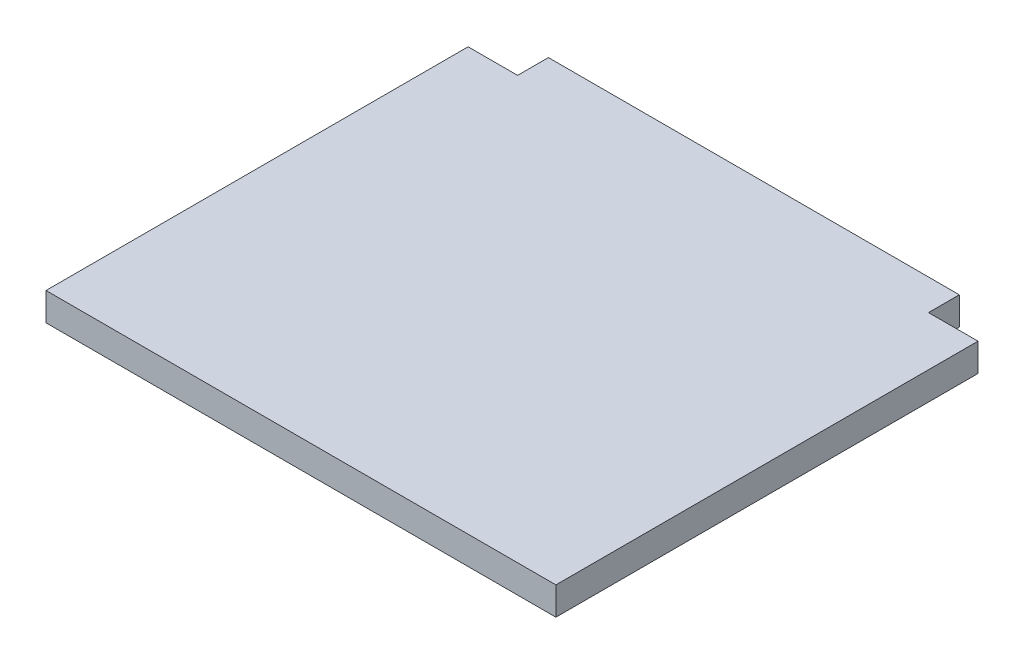
ISO-10303-21;
HEADER;
FILE_DESCRIPTION(('STEP AP214'),'2;1');
FILE_NAME('part.step','',(''),(''),'','','');
FILE_SCHEMA(('AUTOMOTIVE_DESIGN { 1 0 10303 214 1 1 1 1 }'));
ENDSEC;
DATA;
#1=APPLICATION_CONTEXT('core data for automotive mechanical design processes');
#2=APPLICATION_PROTOCOL_DEFINITION('international standard','automotive_design',2000,#1);
#3=PRODUCT_CONTEXT('',#1,'mechanical');
#4=PRODUCT('Part','Part','',(#3));
#5=PRODUCT_RELATED_PRODUCT_CATEGORY('part','',(#4));
#6=PRODUCT_DEFINITION_FORMATION('','',#4);
#7=PRODUCT_DEFINITION_CONTEXT('part definition',#1,'design');
#8=PRODUCT_DEFINITION('design','',#6,#7);
#9=PRODUCT_DEFINITION_SHAPE('','',#8);
#10=(LENGTH_UNIT() NAMED_UNIT(*) SI_UNIT(.MILLI.,.METRE.));
#11=(NAMED_UNIT(*) PLANE_ANGLE_UNIT() SI_UNIT($,.RADIAN.));
#12=(NAMED_UNIT(*) SI_UNIT($,.STERADIAN.) SOLID_ANGLE_UNIT());
#13=UNCERTAINTY_MEASURE_WITH_UNIT(LENGTH_MEASURE(1.E-05),#10,'distance_accuracy_value','');
#14=(GEOMETRIC_REPRESENTATION_CONTEXT(3) GLOBAL_UNCERTAINTY_ASSIGNED_CONTEXT((#13)) GLOBAL_UNIT_ASSIGNED_CONTEXT((#10,
#11,#12)) REPRESENTATION_CONTEXT('',''));
#15=CARTESIAN_POINT('',(0.,0.,0.));
#16=DIRECTION('',(0.,0.,1.));
#17=DIRECTION('',(1.,0.,0.));
#18=AXIS2_PLACEMENT_3D('',#15,#16,#17);
#19=CARTESIAN_POINT('',(27.3,-3.,-22.6));
#20=DIRECTION('',(1.,0.,0.));
#21=DIRECTION('',(0.,0.,-1.));
#22=AXIS2_PLACEMENT_3D('',#19,#20,#21);
#23=PLANE('',#22);
#24=DIRECTION('',(0.,0.,-1.));
#25=VECTOR('',#24,1.);
#26=CARTESIAN_POINT('',(27.3,0.,-22.6));
#27=LINE('',#26,#25);
#28=CARTESIAN_POINT('',(27.3,0.,22.6));
#29=VERTEX_POINT('',#28);
#30=CARTESIAN_POINT('',(27.3,0.,-22.6));
#31=VERTEX_POINT('',#30);
#32=EDGE_CURVE('E138',#29,#31,#27,.T.);
#33=ORIENTED_EDGE('',*,*,#32,.F.);
#34=DIRECTION('',(0.,1.,0.));
#35=VECTOR('',#34,1.);
#36=CARTESIAN_POINT('',(27.3,-3.,22.6));
#37=LINE('',#36,#35);
#38=CARTESIAN_POINT('',(27.3,-3.,22.6));
#39=VERTEX_POINT('',#38);
#40=EDGE_CURVE('E11',#39,#29,#37,.T.);
#41=ORIENTED_EDGE('',*,*,#40,.F.);
#42=DIRECTION('',(0.,0.,-1.));
#43=VECTOR('',#42,1.);
#44=CARTESIAN_POINT('',(27.3,-3.,-22.6));
#45=LINE('',#44,#43);
#46=CARTESIAN_POINT('',(27.3,-3.,-22.6));
#47=VERTEX_POINT('',#46);
#48=EDGE_CURVE('E158',#39,#47,#45,.T.);
#49=ORIENTED_EDGE('',*,*,#48,.T.);
#50=DIRECTION('',(0.,1.,0.));
#51=VECTOR('',#50,1.);
#52=CARTESIAN_POINT('',(27.3,-3.,-22.6));
#53=LINE('',#52,#51);
#54=EDGE_CURVE('E44',#47,#31,#53,.T.);
#55=ORIENTED_EDGE('',*,*,#54,.T.);
#56=EDGE_LOOP('',(#33,#41,#49,#55));
#57=FACE_BOUND('',#56,.T.);
#58=ADVANCED_FACE('F41',(#57),#23,.T.);
#59=CARTESIAN_POINT('',(-27.3,-3.,22.6));
#60=DIRECTION('',(0.,0.,1.));
#61=DIRECTION('',(1.,0.,0.));
#62=AXIS2_PLACEMENT_3D('',#59,#60,#61);
#63=PLANE('',#62);
#64=DIRECTION('',(1.,0.,0.));
#65=VECTOR('',#64,1.);
#66=CARTESIAN_POINT('',(-27.3,0.,22.6));
#67=LINE('',#66,#65);
#68=CARTESIAN_POINT('',(-27.3,0.,22.6));
#69=VERTEX_POINT('',#68);
#70=EDGE_CURVE('E156',#69,#29,#67,.T.);
#71=ORIENTED_EDGE('',*,*,#70,.F.);
#72=DIRECTION('',(0.,1.,0.));
#73=VECTOR('',#72,1.);
#74=CARTESIAN_POINT('',(-27.3,-3.,22.6));
#75=LINE('',#74,#73);
#76=CARTESIAN_POINT('',(-27.3,-3.,22.6));
#77=VERTEX_POINT('',#76);
#78=EDGE_CURVE('E50',#77,#69,#75,.T.);
#79=ORIENTED_EDGE('',*,*,#78,.F.);
#80=DIRECTION('',(1.,0.,0.));
#81=VECTOR('',#80,1.);
#82=CARTESIAN_POINT('',(-27.3,-3.,22.6));
#83=LINE('',#82,#81);
#84=EDGE_CURVE('E128',#77,#39,#83,.T.);
#85=ORIENTED_EDGE('',*,*,#84,.T.);
#86=ORIENTED_EDGE('',*,*,#40,.T.);
#87=EDGE_LOOP('',(#71,#79,#85,#86));
#88=FACE_BOUND('',#87,.T.);
#89=ADVANCED_FACE('F170',(#88),#63,.T.);
#90=CARTESIAN_POINT('',(-27.3,-3.,-22.6));
#91=DIRECTION('',(-1.,0.,0.));
#92=DIRECTION('',(0.,0.,1.));
#93=AXIS2_PLACEMENT_3D('',#90,#91,#92);
#94=PLANE('',#93);
#95=DIRECTION('',(0.,0.,1.));
#96=VECTOR('',#95,1.);
#97=CARTESIAN_POINT('',(-27.3,0.,-22.6));
#98=LINE('',#97,#96);
#99=CARTESIAN_POINT('',(-27.3,0.,-22.6));
#100=VERTEX_POINT('',#99);
#101=EDGE_CURVE('E115',#100,#69,#98,.T.);
#102=ORIENTED_EDGE('',*,*,#101,.F.);
#103=DIRECTION('',(0.,1.,0.));
#104=VECTOR('',#103,1.);
#105=CARTESIAN_POINT('',(-27.3,-3.,-22.6));
#106=LINE('',#105,#104);
#107=CARTESIAN_POINT('',(-27.3,-3.,-22.6));
#108=VERTEX_POINT('',#107);
#109=EDGE_CURVE('E110',#108,#100,#106,.T.);
#110=ORIENTED_EDGE('',*,*,#109,.F.);
#111=DIRECTION('',(0.,0.,1.));
#112=VECTOR('',#111,1.);
#113=CARTESIAN_POINT('',(-27.3,-3.,-22.6));
#114=LINE('',#113,#112);
#115=EDGE_CURVE('E113',#108,#77,#114,.T.);
#116=ORIENTED_EDGE('',*,*,#115,.T.);
#117=ORIENTED_EDGE('',*,*,#78,.T.);
#118=EDGE_LOOP('',(#102,#110,#116,#117));
#119=FACE_BOUND('',#118,.T.);
#120=ADVANCED_FACE('F112',(#119),#94,.T.);
#121=CARTESIAN_POINT('',(-27.3,-3.,-22.6));
#122=DIRECTION('',(0.,0.,-1.));
#123=DIRECTION('',(-1.,0.,0.));
#124=AXIS2_PLACEMENT_3D('',#121,#122,#123);
#125=PLANE('',#124);
#126=DIRECTION('',(-1.,0.,0.));
#127=VECTOR('',#126,1.);
#128=CARTESIAN_POINT('',(-27.3,0.,-22.6));
#129=LINE('',#128,#127);
#130=CARTESIAN_POINT('',(-22.,0.,-22.6));
#131=VERTEX_POINT('',#130);
#132=EDGE_CURVE('E153',#131,#100,#129,.T.);
#133=ORIENTED_EDGE('',*,*,#132,.F.);
#134=DIRECTION('',(0.,1.,0.));
#135=VECTOR('',#134,1.);
#136=CARTESIAN_POINT('',(-22.,-3.,-22.6));
#137=LINE('',#136,#135);
#138=CARTESIAN_POINT('',(-22.,-3.,-22.6));
#139=VERTEX_POINT('',#138);
#140=EDGE_CURVE('E120',#139,#131,#137,.T.);
#141=ORIENTED_EDGE('',*,*,#140,.F.);
#142=DIRECTION('',(-1.,0.,0.));
#143=VECTOR('',#142,1.);
#144=CARTESIAN_POINT('',(-27.3,-3.,-22.6));
#145=LINE('',#144,#143);
#146=EDGE_CURVE('E126',#139,#108,#145,.T.);
#147=ORIENTED_EDGE('',*,*,#146,.T.);
#148=ORIENTED_EDGE('',*,*,#109,.T.);
#149=EDGE_LOOP('',(#133,#141,#147,#148));
#150=FACE_BOUND('',#149,.T.);
#151=ADVANCED_FACE('F130',(#150),#125,.T.);
#152=CARTESIAN_POINT('',(-22.,-3.,-25.9));
#153=DIRECTION('',(-1.,0.,0.));
#154=DIRECTION('',(0.,0.,1.));
#155=AXIS2_PLACEMENT_3D('',#152,#153,#154);
#156=PLANE('',#155);
#157=DIRECTION('',(0.,0.,1.));
#158=VECTOR('',#157,1.);
#159=CARTESIAN_POINT('',(-22.,0.,-25.9));
#160=LINE('',#159,#158);
#161=CARTESIAN_POINT('',(-22.,0.,-25.9));
#162=VERTEX_POINT('',#161);
#163=EDGE_CURVE('E150',#162,#131,#160,.T.);
#164=ORIENTED_EDGE('',*,*,#163,.F.);
#165=DIRECTION('',(0.,1.,0.));
#166=VECTOR('',#165,1.);
#167=CARTESIAN_POINT('',(-22.,-3.,-25.9));
#168=LINE('',#167,#166);
#169=CARTESIAN_POINT('',(-22.,-3.,-25.9));
#170=VERTEX_POINT('',#169);
#171=EDGE_CURVE('E162',#170,#162,#168,.T.);
#172=ORIENTED_EDGE('',*,*,#171,.F.);
#173=DIRECTION('',(0.,0.,1.));
#174=VECTOR('',#173,1.);
#175=CARTESIAN_POINT('',(-22.,-3.,-25.9));
#176=LINE('',#175,#174);
#177=EDGE_CURVE('E131',#170,#139,#176,.T.);
#178=ORIENTED_EDGE('',*,*,#177,.T.);
#179=ORIENTED_EDGE('',*,*,#140,.T.);
#180=EDGE_LOOP('',(#164,#172,#178,#179));
#181=FACE_BOUND('',#180,.T.);
#182=ADVANCED_FACE('F183',(#181),#156,.T.);
#183=CARTESIAN_POINT('',(-22.,-3.,-25.9));
#184=DIRECTION('',(0.,0.,-1.));
#185=DIRECTION('',(-1.,0.,0.));
#186=AXIS2_PLACEMENT_3D('',#183,#184,#185);
#187=PLANE('',#186);
#188=DIRECTION('',(-1.,0.,0.));
#189=VECTOR('',#188,1.);
#190=CARTESIAN_POINT('',(-22.,0.,-25.9));
#191=LINE('',#190,#189);
#192=CARTESIAN_POINT('',(22.,0.,-25.9));
#193=VERTEX_POINT('',#192);
#194=EDGE_CURVE('E147',#193,#162,#191,.T.);
#195=ORIENTED_EDGE('',*,*,#194,.F.);
#196=DIRECTION('',(0.,1.,0.));
#197=VECTOR('',#196,1.);
#198=CARTESIAN_POINT('',(22.,-3.,-25.9));
#199=LINE('',#198,#197);
#200=CARTESIAN_POINT('',(22.,-3.,-25.9));
#201=VERTEX_POINT('',#200);
#202=EDGE_CURVE('E164',#201,#193,#199,.T.);
#203=ORIENTED_EDGE('',*,*,#202,.F.);
#204=DIRECTION('',(-1.,0.,0.));
#205=VECTOR('',#204,1.);
#206=CARTESIAN_POINT('',(-22.,-3.,-25.9));
#207=LINE('',#206,#205);
#208=EDGE_CURVE('E133',#201,#170,#207,.T.);
#209=ORIENTED_EDGE('',*,*,#208,.T.);
#210=ORIENTED_EDGE('',*,*,#171,.T.);
#211=EDGE_LOOP('',(#195,#203,#209,#210));
#212=FACE_BOUND('',#211,.T.);
#213=ADVANCED_FACE('F186',(#212),#187,.T.);
#214=CARTESIAN_POINT('',(22.,-3.,-25.9));
#215=DIRECTION('',(1.,0.,0.));
#216=DIRECTION('',(0.,0.,-1.));
#217=AXIS2_PLACEMENT_3D('',#214,#215,#216);
#218=PLANE('',#217);
#219=DIRECTION('',(0.,0.,-1.));
#220=VECTOR('',#219,1.);
#221=CARTESIAN_POINT('',(22.,0.,-25.9));
#222=LINE('',#221,#220);
#223=CARTESIAN_POINT('',(22.,0.,-22.6));
#224=VERTEX_POINT('',#223);
#225=EDGE_CURVE('E144',#224,#193,#222,.T.);
#226=ORIENTED_EDGE('',*,*,#225,.F.);
#227=DIRECTION('',(0.,1.,0.));
#228=VECTOR('',#227,1.);
#229=CARTESIAN_POINT('',(22.,-3.,-22.6));
#230=LINE('',#229,#228);
#231=CARTESIAN_POINT('',(22.,-3.,-22.6));
#232=VERTEX_POINT('',#231);
#233=EDGE_CURVE('E165',#232,#224,#230,.T.);
#234=ORIENTED_EDGE('',*,*,#233,.F.);
#235=DIRECTION('',(0.,0.,-1.));
#236=VECTOR('',#235,1.);
#237=CARTESIAN_POINT('',(22.,-3.,-25.9));
#238=LINE('',#237,#236);
#239=EDGE_CURVE('E261',#232,#201,#238,.T.);
#240=ORIENTED_EDGE('',*,*,#239,.T.);
#241=ORIENTED_EDGE('',*,*,#202,.T.);
#242=EDGE_LOOP('',(#226,#234,#240,#241));
#243=FACE_BOUND('',#242,.T.);
#244=ADVANCED_FACE('F190',(#243),#218,.T.);
#245=CARTESIAN_POINT('',(22.,-3.,-22.6));
#246=DIRECTION('',(0.,0.,-1.));
#247=DIRECTION('',(-1.,0.,0.));
#248=AXIS2_PLACEMENT_3D('',#245,#246,#247);
#249=PLANE('',#248);
#250=DIRECTION('',(-1.,0.,0.));
#251=VECTOR('',#250,1.);
#252=CARTESIAN_POINT('',(22.,0.,-22.6));
#253=LINE('',#252,#251);
#254=EDGE_CURVE('E141',#31,#224,#253,.T.);
#255=ORIENTED_EDGE('',*,*,#254,.F.);
#256=ORIENTED_EDGE('',*,*,#54,.F.);
#257=DIRECTION('',(-1.,0.,0.));
#258=VECTOR('',#257,1.);
#259=CARTESIAN_POINT('',(22.,-3.,-22.6));
#260=LINE('',#259,#258);
#261=EDGE_CURVE('E262',#47,#232,#260,.T.);
#262=ORIENTED_EDGE('',*,*,#261,.T.);
#263=ORIENTED_EDGE('',*,*,#233,.T.);
#264=EDGE_LOOP('',(#255,#256,#262,#263));
#265=FACE_BOUND('',#264,.T.);
#266=ADVANCED_FACE('F167',(#265),#249,.T.);
#267=CARTESIAN_POINT('',(0.,-3.,0.));
#268=DIRECTION('',(0.,1.,0.));
#269=DIRECTION('',(0.,0.,1.));
#270=AXIS2_PLACEMENT_3D('',#267,#268,#269);
#271=PLANE('',#270);
#272=ORIENTED_EDGE('',*,*,#48,.F.);
#273=ORIENTED_EDGE('',*,*,#84,.F.);
#274=ORIENTED_EDGE('',*,*,#115,.F.);
#275=ORIENTED_EDGE('',*,*,#146,.F.);
#276=ORIENTED_EDGE('',*,*,#177,.F.);
#277=ORIENTED_EDGE('',*,*,#208,.F.);
#278=ORIENTED_EDGE('',*,*,#239,.F.);
#279=ORIENTED_EDGE('',*,*,#261,.F.);
#280=EDGE_LOOP('',(#272,#273,#274,#275,#276,#277,#278,#279));
#281=FACE_BOUND('',#280,.T.);
#282=ADVANCED_FACE('F124',(#281),#271,.F.);
#283=CARTESIAN_POINT('',(0.,0.,0.));
#284=DIRECTION('',(0.,1.,0.));
#285=DIRECTION('',(0.,0.,1.));
#286=AXIS2_PLACEMENT_3D('',#283,#284,#285);
#287=PLANE('',#286);
#288=ORIENTED_EDGE('',*,*,#32,.T.);
#289=ORIENTED_EDGE('',*,*,#254,.T.);
#290=ORIENTED_EDGE('',*,*,#225,.T.);
#291=ORIENTED_EDGE('',*,*,#194,.T.);
#292=ORIENTED_EDGE('',*,*,#163,.T.);
#293=ORIENTED_EDGE('',*,*,#132,.T.);
#294=ORIENTED_EDGE('',*,*,#101,.T.);
#295=ORIENTED_EDGE('',*,*,#70,.T.);
#296=EDGE_LOOP('',(#288,#289,#290,#291,#292,#293,#294,#295));
#297=FACE_BOUND('',#296,.T.);
#298=ADVANCED_FACE('F169',(#297),#287,.T.);
#299=CLOSED_SHELL('',(#58,#89,#120,#151,#182,#213,#244,#266,#282,#298));
#300=MANIFOLD_SOLID_BREP('B2',#299);
#301=ADVANCED_BREP_SHAPE_REPRESENTATION('',(#18,#300),#14);
#302=SHAPE_DEFINITION_REPRESENTATION(#9,#301);
ENDSEC;
END-ISO-10303-21;
